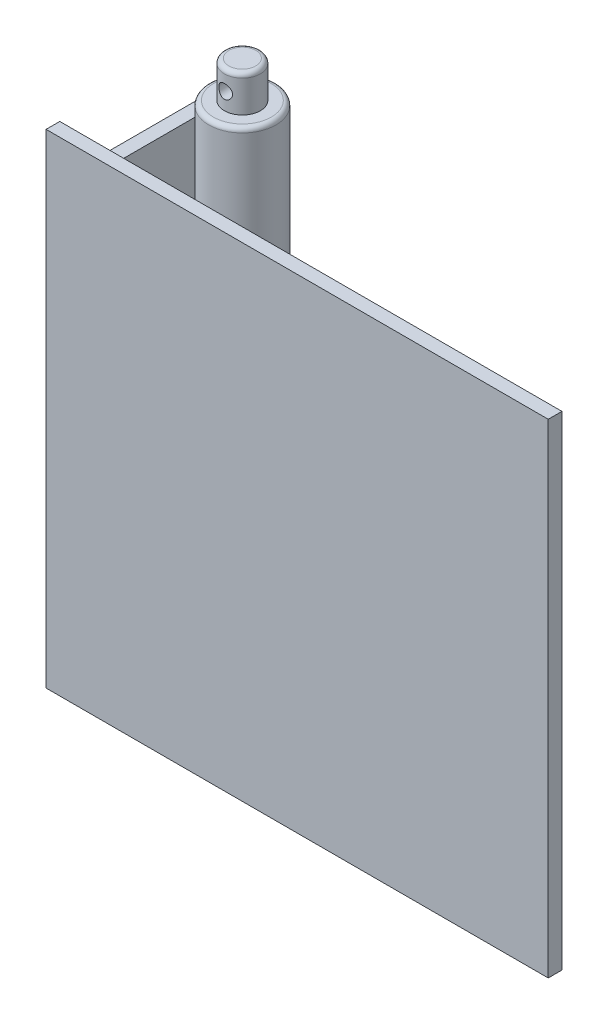
ISO-10303-21;
HEADER;
FILE_DESCRIPTION(('STEP AP214'),'2;1');
FILE_NAME('part.step','',(''),(''),'','','');
FILE_SCHEMA(('AUTOMOTIVE_DESIGN { 1 0 10303 214 1 1 1 1 }'));
ENDSEC;
DATA;
#1=APPLICATION_CONTEXT('core data for automotive mechanical design processes');
#2=APPLICATION_PROTOCOL_DEFINITION('international standard','automotive_design',2000,#1);
#3=PRODUCT_CONTEXT('',#1,'mechanical');
#4=PRODUCT('Part','Part','',(#3));
#5=PRODUCT_RELATED_PRODUCT_CATEGORY('part','',(#4));
#6=PRODUCT_DEFINITION_FORMATION('','',#4);
#7=PRODUCT_DEFINITION_CONTEXT('part definition',#1,'design');
#8=PRODUCT_DEFINITION('design','',#6,#7);
#9=PRODUCT_DEFINITION_SHAPE('','',#8);
#10=(LENGTH_UNIT() NAMED_UNIT(*) SI_UNIT(.MILLI.,.METRE.));
#11=(NAMED_UNIT(*) PLANE_ANGLE_UNIT() SI_UNIT($,.RADIAN.));
#12=(NAMED_UNIT(*) SI_UNIT($,.STERADIAN.) SOLID_ANGLE_UNIT());
#13=UNCERTAINTY_MEASURE_WITH_UNIT(LENGTH_MEASURE(1.E-05),#10,'distance_accuracy_value','');
#14=(GEOMETRIC_REPRESENTATION_CONTEXT(3) GLOBAL_UNCERTAINTY_ASSIGNED_CONTEXT((#13)) GLOBAL_UNIT_ASSIGNED_CONTEXT((#10,
#11,#12)) REPRESENTATION_CONTEXT('',''));
#15=CARTESIAN_POINT('',(0.,0.,0.));
#16=DIRECTION('',(0.,0.,1.));
#17=DIRECTION('',(1.,0.,0.));
#18=AXIS2_PLACEMENT_3D('',#15,#16,#17);
#19=CARTESIAN_POINT('',(4.99999999999997,90.,-38.));
#20=DIRECTION('',(1.,0.,0.));
#21=DIRECTION('',(0.,1.,0.));
#22=AXIS2_PLACEMENT_3D('',#19,#20,#21);
#23=PLANE('',#22);
#24=DIRECTION('',(0.,1.,0.));
#25=VECTOR('',#24,1.);
#26=CARTESIAN_POINT('',(4.99999999999996,90.,-26.));
#27=LINE('',#26,#25);
#28=CARTESIAN_POINT('',(4.99999999999996,-3.99999999999999,-26.));
#29=VERTEX_POINT('',#28);
#30=CARTESIAN_POINT('',(4.99999999999996,90.,-26.));
#31=VERTEX_POINT('',#30);
#32=EDGE_CURVE('E145',#29,#31,#27,.T.);
#33=ORIENTED_EDGE('',*,*,#32,.F.);
#34=DIRECTION('',(0.,0.,1.));
#35=VECTOR('',#34,1.);
#36=CARTESIAN_POINT('',(4.99999999999996,-3.99999999999999,-38.));
#37=LINE('',#36,#35);
#38=CARTESIAN_POINT('',(4.99999999999996,-3.99999999999999,0.));
#39=VERTEX_POINT('',#38);
#40=EDGE_CURVE('E180',#29,#39,#37,.T.);
#41=ORIENTED_EDGE('',*,*,#40,.T.);
#42=DIRECTION('',(0.,1.,0.));
#43=VECTOR('',#42,1.);
#44=CARTESIAN_POINT('',(4.99999999999997,90.,0.));
#45=LINE('',#44,#43);
#46=CARTESIAN_POINT('',(4.99999999999997,90.,0.));
#47=VERTEX_POINT('',#46);
#48=EDGE_CURVE('E168',#39,#47,#45,.T.);
#49=ORIENTED_EDGE('',*,*,#48,.T.);
#50=DIRECTION('',(0.,0.,1.));
#51=VECTOR('',#50,1.);
#52=CARTESIAN_POINT('',(4.99999999999997,90.,-38.));
#53=LINE('',#52,#51);
#54=EDGE_CURVE('E186',#31,#47,#53,.T.);
#55=ORIENTED_EDGE('',*,*,#54,.F.);
#56=EDGE_LOOP('',(#33,#41,#49,#55));
#57=FACE_BOUND('',#56,.T.);
#58=ADVANCED_FACE('F41',(#57),#23,.F.);
#59=CARTESIAN_POINT('',(7.99999999999997,90.,-38.));
#60=DIRECTION('',(0.,-1.,0.));
#61=DIRECTION('',(0.,0.,-1.));
#62=AXIS2_PLACEMENT_3D('',#59,#60,#61);
#63=PLANE('',#62);
#64=DIRECTION('',(1.,0.,0.));
#65=VECTOR('',#64,1.);
#66=CARTESIAN_POINT('',(7.99999999999997,90.,-26.));
#67=LINE('',#66,#65);
#68=CARTESIAN_POINT('',(7.71834496834681,90.,-26.));
#69=VERTEX_POINT('',#68);
#70=EDGE_CURVE('E138',#31,#69,#67,.T.);
#71=ORIENTED_EDGE('',*,*,#70,.F.);
#72=ORIENTED_EDGE('',*,*,#54,.T.);
#73=DIRECTION('',(1.,0.,0.));
#74=VECTOR('',#73,1.);
#75=CARTESIAN_POINT('',(7.99999999999997,90.,0.));
#76=LINE('',#75,#74);
#77=CARTESIAN_POINT('',(7.99999999999997,90.,0.));
#78=VERTEX_POINT('',#77);
#79=EDGE_CURVE('E171',#47,#78,#76,.T.);
#80=ORIENTED_EDGE('',*,*,#79,.T.);
#81=DIRECTION('',(0.,0.,1.));
#82=VECTOR('',#81,1.);
#83=CARTESIAN_POINT('',(7.99999999999997,90.,-38.));
#84=LINE('',#83,#82);
#85=CARTESIAN_POINT('',(7.99999999999997,90.,-22.7589065168986));
#86=VERTEX_POINT('',#85);
#87=EDGE_CURVE('E184',#86,#78,#84,.T.);
#88=ORIENTED_EDGE('',*,*,#87,.F.);
#89=CARTESIAN_POINT('',(15.,90.,-25.));
#90=DIRECTION('',(0.,-1.,0.));
#91=DIRECTION('',(0.,0.,-1.));
#92=AXIS2_PLACEMENT_3D('',#89,#90,#91);
#93=CIRCLE('',#92,7.35);
#94=EDGE_CURVE('E56',#69,#86,#93,.F.);
#95=ORIENTED_EDGE('',*,*,#94,.F.);
#96=EDGE_LOOP('',(#71,#72,#80,#88,#95));
#97=FACE_BOUND('',#96,.T.);
#98=ADVANCED_FACE('F266',(#97),#63,.F.);
#99=CARTESIAN_POINT('',(4.99999999999996,-3.99999999999999,-38.));
#100=DIRECTION('',(0.,1.,0.));
#101=DIRECTION('',(0.,0.,1.));
#102=AXIS2_PLACEMENT_3D('',#99,#100,#101);
#103=PLANE('',#102);
#104=DIRECTION('',(-1.,0.,0.));
#105=VECTOR('',#104,1.);
#106=CARTESIAN_POINT('',(7.99999999999996,-3.99999999999999,-26.));
#107=LINE('',#106,#105);
#108=CARTESIAN_POINT('',(7.71834496834681,-3.99999999999999,-26.));
#109=VERTEX_POINT('',#108);
#110=EDGE_CURVE('E146',#109,#29,#107,.T.);
#111=ORIENTED_EDGE('',*,*,#110,.F.);
#112=CARTESIAN_POINT('',(15.,-3.99999999999999,-25.));
#113=DIRECTION('',(0.,1.,0.));
#114=DIRECTION('',(0.,0.,1.));
#115=AXIS2_PLACEMENT_3D('',#112,#113,#114);
#116=CIRCLE('',#115,7.35);
#117=CARTESIAN_POINT('',(7.99999999999997,-3.99999999999999,-22.7589065168986));
#118=VERTEX_POINT('',#117);
#119=EDGE_CURVE('E64',#118,#109,#116,.F.);
#120=ORIENTED_EDGE('',*,*,#119,.F.);
#121=DIRECTION('',(0.,0.,1.));
#122=VECTOR('',#121,1.);
#123=CARTESIAN_POINT('',(7.99999999999997,-3.99999999999999,-38.));
#124=LINE('',#123,#122);
#125=CARTESIAN_POINT('',(7.99999999999997,-3.99999999999999,0.));
#126=VERTEX_POINT('',#125);
#127=EDGE_CURVE('E182',#118,#126,#124,.T.);
#128=ORIENTED_EDGE('',*,*,#127,.T.);
#129=DIRECTION('',(-1.,0.,0.));
#130=VECTOR('',#129,1.);
#131=CARTESIAN_POINT('',(4.99999999999996,-3.99999999999999,0.));
#132=LINE('',#131,#130);
#133=EDGE_CURVE('E177',#126,#39,#132,.T.);
#134=ORIENTED_EDGE('',*,*,#133,.T.);
#135=ORIENTED_EDGE('',*,*,#40,.F.);
#136=EDGE_LOOP('',(#111,#120,#128,#134,#135));
#137=FACE_BOUND('',#136,.T.);
#138=ADVANCED_FACE('F273',(#137),#103,.F.);
#139=CARTESIAN_POINT('',(7.99999999999997,-3.99999999999999,-38.));
#140=DIRECTION('',(-1.,0.,0.));
#141=DIRECTION('',(0.,0.,1.));
#142=AXIS2_PLACEMENT_3D('',#139,#140,#141);
#143=PLANE('',#142);
#144=DIRECTION('',(0.,-1.,0.));
#145=VECTOR('',#144,1.);
#146=CARTESIAN_POINT('',(7.99999999999997,95.,-22.7589065168986));
#147=LINE('',#146,#145);
#148=EDGE_CURVE('E162',#86,#118,#147,.T.);
#149=ORIENTED_EDGE('',*,*,#148,.F.);
#150=ORIENTED_EDGE('',*,*,#87,.T.);
#151=DIRECTION('',(0.,-1.,0.));
#152=VECTOR('',#151,1.);
#153=CARTESIAN_POINT('',(7.99999999999997,-3.99999999999999,0.));
#154=LINE('',#153,#152);
#155=EDGE_CURVE('E174',#78,#126,#154,.T.);
#156=ORIENTED_EDGE('',*,*,#155,.T.);
#157=ORIENTED_EDGE('',*,*,#127,.F.);
#158=EDGE_LOOP('',(#149,#150,#156,#157));
#159=FACE_BOUND('',#158,.T.);
#160=ADVANCED_FACE('F289',(#159),#143,.F.);
#161=CARTESIAN_POINT('',(0.,0.,0.));
#162=DIRECTION('',(0.,0.,-1.));
#163=DIRECTION('',(-1.,0.,0.));
#164=AXIS2_PLACEMENT_3D('',#161,#162,#163);
#165=PLANE('',#164);
#166=DIRECTION('',(0.,-1.,0.));
#167=VECTOR('',#166,1.);
#168=CARTESIAN_POINT('',(0.,-9.99999999999999,0.));
#169=LINE('',#168,#167);
#170=CARTESIAN_POINT('',(0.,96.,0.));
#171=VERTEX_POINT('',#170);
#172=CARTESIAN_POINT('',(0.,-9.99999999999999,0.));
#173=VERTEX_POINT('',#172);
#174=EDGE_CURVE('E188',#171,#173,#169,.T.);
#175=ORIENTED_EDGE('',*,*,#174,.F.);
#176=DIRECTION('',(-1.,0.,0.));
#177=VECTOR('',#176,1.);
#178=CARTESIAN_POINT('',(0.,96.,0.));
#179=LINE('',#178,#177);
#180=CARTESIAN_POINT('',(110.,96.,0.));
#181=VERTEX_POINT('',#180);
#182=EDGE_CURVE('E193',#181,#171,#179,.T.);
#183=ORIENTED_EDGE('',*,*,#182,.F.);
#184=DIRECTION('',(0.,1.,0.));
#185=VECTOR('',#184,1.);
#186=CARTESIAN_POINT('',(110.,-9.99999999999999,0.));
#187=LINE('',#186,#185);
#188=CARTESIAN_POINT('',(110.,-9.99999999999999,0.));
#189=VERTEX_POINT('',#188);
#190=EDGE_CURVE('E204',#189,#181,#187,.T.);
#191=ORIENTED_EDGE('',*,*,#190,.F.);
#192=DIRECTION('',(1.,0.,0.));
#193=VECTOR('',#192,1.);
#194=CARTESIAN_POINT('',(0.,-9.99999999999999,0.));
#195=LINE('',#194,#193);
#196=EDGE_CURVE('E202',#173,#189,#195,.T.);
#197=ORIENTED_EDGE('',*,*,#196,.F.);
#198=EDGE_LOOP('',(#175,#183,#191,#197));
#199=FACE_BOUND('',#198,.T.);
#200=ORIENTED_EDGE('',*,*,#79,.F.);
#201=ORIENTED_EDGE('',*,*,#48,.F.);
#202=ORIENTED_EDGE('',*,*,#133,.F.);
#203=ORIENTED_EDGE('',*,*,#155,.F.);
#204=EDGE_LOOP('',(#200,#201,#202,#203));
#205=FACE_BOUND('',#204,.T.);
#206=ADVANCED_FACE('F285',(#199,#205),#165,.T.);
#207=CARTESIAN_POINT('',(0.,-9.99999999999999,3.));
#208=DIRECTION('',(1.,0.,0.));
#209=DIRECTION('',(0.,1.,0.));
#210=AXIS2_PLACEMENT_3D('',#207,#208,#209);
#211=PLANE('',#210);
#212=ORIENTED_EDGE('',*,*,#174,.T.);
#213=DIRECTION('',(0.,0.,-1.));
#214=VECTOR('',#213,1.);
#215=CARTESIAN_POINT('',(0.,-9.99999999999999,3.));
#216=LINE('',#215,#214);
#217=CARTESIAN_POINT('',(0.,-9.99999999999999,3.));
#218=VERTEX_POINT('',#217);
#219=EDGE_CURVE('E215',#218,#173,#216,.T.);
#220=ORIENTED_EDGE('',*,*,#219,.F.);
#221=DIRECTION('',(0.,-1.,0.));
#222=VECTOR('',#221,1.);
#223=CARTESIAN_POINT('',(0.,-9.99999999999999,3.));
#224=LINE('',#223,#222);
#225=CARTESIAN_POINT('',(0.,96.,3.));
#226=VERTEX_POINT('',#225);
#227=EDGE_CURVE('E189',#226,#218,#224,.T.);
#228=ORIENTED_EDGE('',*,*,#227,.F.);
#229=DIRECTION('',(0.,0.,-1.));
#230=VECTOR('',#229,1.);
#231=CARTESIAN_POINT('',(0.,96.,3.));
#232=LINE('',#231,#230);
#233=EDGE_CURVE('E199',#226,#171,#232,.T.);
#234=ORIENTED_EDGE('',*,*,#233,.T.);
#235=EDGE_LOOP('',(#212,#220,#228,#234));
#236=FACE_BOUND('',#235,.T.);
#237=ADVANCED_FACE('F288',(#236),#211,.F.);
#238=CARTESIAN_POINT('',(0.,-9.99999999999999,3.));
#239=DIRECTION('',(0.,1.,0.));
#240=DIRECTION('',(0.,0.,1.));
#241=AXIS2_PLACEMENT_3D('',#238,#239,#240);
#242=PLANE('',#241);
#243=ORIENTED_EDGE('',*,*,#196,.T.);
#244=DIRECTION('',(0.,0.,-1.));
#245=VECTOR('',#244,1.);
#246=CARTESIAN_POINT('',(110.,-9.99999999999999,3.));
#247=LINE('',#246,#245);
#248=CARTESIAN_POINT('',(110.,-9.99999999999999,3.));
#249=VERTEX_POINT('',#248);
#250=EDGE_CURVE('E212',#249,#189,#247,.T.);
#251=ORIENTED_EDGE('',*,*,#250,.F.);
#252=DIRECTION('',(1.,0.,0.));
#253=VECTOR('',#252,1.);
#254=CARTESIAN_POINT('',(0.,-9.99999999999999,3.));
#255=LINE('',#254,#253);
#256=EDGE_CURVE('E192',#218,#249,#255,.T.);
#257=ORIENTED_EDGE('',*,*,#256,.F.);
#258=ORIENTED_EDGE('',*,*,#219,.T.);
#259=EDGE_LOOP('',(#243,#251,#257,#258));
#260=FACE_BOUND('',#259,.T.);
#261=ADVANCED_FACE('F297',(#260),#242,.F.);
#262=CARTESIAN_POINT('',(110.,-9.99999999999999,3.));
#263=DIRECTION('',(-1.,0.,0.));
#264=DIRECTION('',(0.,-1.,0.));
#265=AXIS2_PLACEMENT_3D('',#262,#263,#264);
#266=PLANE('',#265);
#267=ORIENTED_EDGE('',*,*,#190,.T.);
#268=DIRECTION('',(0.,0.,-1.));
#269=VECTOR('',#268,1.);
#270=CARTESIAN_POINT('',(110.,96.,3.));
#271=LINE('',#270,#269);
#272=CARTESIAN_POINT('',(110.,96.,3.));
#273=VERTEX_POINT('',#272);
#274=EDGE_CURVE('E209',#273,#181,#271,.T.);
#275=ORIENTED_EDGE('',*,*,#274,.F.);
#276=DIRECTION('',(0.,1.,0.));
#277=VECTOR('',#276,1.);
#278=CARTESIAN_POINT('',(110.,-9.99999999999999,3.));
#279=LINE('',#278,#277);
#280=EDGE_CURVE('E195',#249,#273,#279,.T.);
#281=ORIENTED_EDGE('',*,*,#280,.F.);
#282=ORIENTED_EDGE('',*,*,#250,.T.);
#283=EDGE_LOOP('',(#267,#275,#281,#282));
#284=FACE_BOUND('',#283,.T.);
#285=ADVANCED_FACE('F293',(#284),#266,.F.);
#286=CARTESIAN_POINT('',(0.,96.,3.));
#287=DIRECTION('',(0.,-1.,0.));
#288=DIRECTION('',(0.,0.,-1.));
#289=AXIS2_PLACEMENT_3D('',#286,#287,#288);
#290=PLANE('',#289);
#291=ORIENTED_EDGE('',*,*,#182,.T.);
#292=ORIENTED_EDGE('',*,*,#233,.F.);
#293=DIRECTION('',(-1.,0.,0.));
#294=VECTOR('',#293,1.);
#295=CARTESIAN_POINT('',(0.,96.,3.));
#296=LINE('',#295,#294);
#297=EDGE_CURVE('E197',#273,#226,#296,.T.);
#298=ORIENTED_EDGE('',*,*,#297,.F.);
#299=ORIENTED_EDGE('',*,*,#274,.T.);
#300=EDGE_LOOP('',(#291,#292,#298,#299));
#301=FACE_BOUND('',#300,.T.);
#302=ADVANCED_FACE('F283',(#301),#290,.F.);
#303=CARTESIAN_POINT('',(0.,0.,3.));
#304=DIRECTION('',(0.,0.,-1.));
#305=DIRECTION('',(-1.,0.,0.));
#306=AXIS2_PLACEMENT_3D('',#303,#304,#305);
#307=PLANE('',#306);
#308=ORIENTED_EDGE('',*,*,#227,.T.);
#309=ORIENTED_EDGE('',*,*,#256,.T.);
#310=ORIENTED_EDGE('',*,*,#280,.T.);
#311=ORIENTED_EDGE('',*,*,#297,.T.);
#312=EDGE_LOOP('',(#308,#309,#310,#311));
#313=FACE_BOUND('',#312,.T.);
#314=ADVANCED_FACE('F279',(#313),#307,.F.);
#315=CARTESIAN_POINT('',(15.,95.,-25.));
#316=DIRECTION('',(0.,-1.,0.));
#317=DIRECTION('',(0.,0.,-1.));
#318=AXIS2_PLACEMENT_3D('',#315,#316,#317);
#319=CYLINDRICAL_SURFACE('',#318,7.35);
#320=CARTESIAN_POINT('',(15.,-13.6220112645898,-25.));
#321=DIRECTION('',(0.,1.,0.));
#322=DIRECTION('',(0.,0.,1.));
#323=AXIS2_PLACEMENT_3D('',#320,#321,#322);
#324=CIRCLE('',#323,7.35);
#325=CARTESIAN_POINT('',(15.,-13.6220112645898,-17.65));
#326=VERTEX_POINT('',#325);
#327=EDGE_CURVE('E11',#326,#326,#324,.T.);
#328=ORIENTED_EDGE('',*,*,#327,.T.);
#329=EDGE_LOOP('',(#328));
#330=FACE_BOUND('',#329,.T.);
#331=CARTESIAN_POINT('',(15.,94.,-25.));
#332=DIRECTION('',(0.,1.,0.));
#333=DIRECTION('',(0.,0.,1.));
#334=AXIS2_PLACEMENT_3D('',#331,#332,#333);
#335=CIRCLE('',#334,7.35);
#336=CARTESIAN_POINT('',(15.,94.,-17.65));
#337=VERTEX_POINT('',#336);
#338=EDGE_CURVE('E227',#337,#337,#335,.F.);
#339=ORIENTED_EDGE('',*,*,#338,.T.);
#340=EDGE_LOOP('',(#339));
#341=FACE_BOUND('',#340,.T.);
#342=DIRECTION('',(0.,-1.,0.));
#343=VECTOR('',#342,1.);
#344=CARTESIAN_POINT('',(7.99999999999997,95.,-27.2410934831015));
#345=LINE('',#344,#343);
#346=CARTESIAN_POINT('',(7.99999999999997,-3.99999999999999,-27.2410934831015));
#347=VERTEX_POINT('',#346);
#348=CARTESIAN_POINT('',(7.99999999999997,90.,-27.2410934831015));
#349=VERTEX_POINT('',#348);
#350=EDGE_CURVE('E134',#347,#349,#345,.F.);
#351=ORIENTED_EDGE('',*,*,#350,.T.);
#352=EDGE_CURVE('E166',#349,#69,#93,.F.);
#353=ORIENTED_EDGE('',*,*,#352,.T.);
#354=ORIENTED_EDGE('',*,*,#94,.T.);
#355=ORIENTED_EDGE('',*,*,#148,.T.);
#356=ORIENTED_EDGE('',*,*,#119,.T.);
#357=EDGE_CURVE('E143',#109,#347,#116,.F.);
#358=ORIENTED_EDGE('',*,*,#357,.T.);
#359=EDGE_LOOP('',(#351,#353,#354,#355,#356,#358));
#360=FACE_BOUND('',#359,.T.);
#361=ADVANCED_FACE('F282',(#330,#341,#360),#319,.T.);
#362=CARTESIAN_POINT('',(15.,95.,-25.));
#363=DIRECTION('',(0.,1.,0.));
#364=DIRECTION('',(0.,0.,1.));
#365=AXIS2_PLACEMENT_3D('',#362,#363,#364);
#366=PLANE('',#365);
#367=CARTESIAN_POINT('',(15.,95.,-25.));
#368=DIRECTION('',(0.,1.,0.));
#369=DIRECTION('',(0.,0.,1.));
#370=AXIS2_PLACEMENT_3D('',#367,#368,#369);
#371=CIRCLE('',#370,6.35);
#372=CARTESIAN_POINT('',(15.,95.,-18.65));
#373=VERTEX_POINT('',#372);
#374=EDGE_CURVE('E224',#373,#373,#371,.T.);
#375=ORIENTED_EDGE('',*,*,#374,.T.);
#376=EDGE_LOOP('',(#375));
#377=FACE_BOUND('',#376,.T.);
#378=CARTESIAN_POINT('',(14.9999999999998,95.,-24.9999999999995));
#379=DIRECTION('',(0.,1.,0.));
#380=DIRECTION('',(0.,0.,1.));
#381=AXIS2_PLACEMENT_3D('',#378,#379,#380);
#382=CIRCLE('',#381,3.95);
#383=CARTESIAN_POINT('',(14.9999999999998,95.,-21.0499999999995));
#384=VERTEX_POINT('',#383);
#385=EDGE_CURVE('E158',#384,#384,#382,.T.);
#386=ORIENTED_EDGE('',*,*,#385,.F.);
#387=EDGE_LOOP('',(#386));
#388=FACE_BOUND('',#387,.T.);
#389=ADVANCED_FACE('F312',(#377,#388),#366,.T.);
#390=CARTESIAN_POINT('',(0.608524712566505,-14.1220112645898,0.355185644143535));
#391=DIRECTION('',(0.,1.,0.));
#392=DIRECTION('',(0.999707965195471,0.,-0.0241657676214048));
#393=AXIS2_PLACEMENT_3D('',#390,#391,#392);
#394=PLANE('',#393);
#395=CARTESIAN_POINT('',(15.,-14.1220112645898,-25.));
#396=DIRECTION('',(0.,1.,0.));
#397=DIRECTION('',(0.,0.,1.));
#398=AXIS2_PLACEMENT_3D('',#395,#396,#397);
#399=CIRCLE('',#398,6.85);
#400=CARTESIAN_POINT('',(15.,-14.1220112645898,-18.15));
#401=VERTEX_POINT('',#400);
#402=EDGE_CURVE('E49',#401,#401,#399,.F.);
#403=ORIENTED_EDGE('',*,*,#402,.T.);
#404=EDGE_LOOP('',(#403));
#405=FACE_BOUND('',#404,.T.);
#406=ADVANCED_FACE('F263',(#405),#394,.F.);
#407=CARTESIAN_POINT('',(14.9999999999998,103.,-24.9999999999995));
#408=DIRECTION('',(0.,-1.,0.));
#409=DIRECTION('',(0.,0.,-1.));
#410=AXIS2_PLACEMENT_3D('',#407,#408,#409);
#411=CYLINDRICAL_SURFACE('',#410,3.95);
#412=CARTESIAN_POINT('',(14.9999999999998,100.17798873541,-28.9499999999995));
#413=CARTESIAN_POINT('',(14.9188382184186,100.177991995215,-28.9500024642297));
#414=CARTESIAN_POINT('',(14.8376984647472,100.171381035976,-28.9474769205789));
#415=CARTESIAN_POINT('',(14.6778478434432,100.14522214936,-28.9376549503403));
#416=CARTESIAN_POINT('',(14.5991365608245,100.125676445279,-28.9303593436601));
#417=CARTESIAN_POINT('',(14.4464716206295,100.074441715519,-28.9117791558993));
#418=CARTESIAN_POINT('',(14.3725089721815,100.042776478792,-28.9005023926174));
#419=CARTESIAN_POINT('',(14.2309520789474,99.9683241467149,-28.8750798343882));
#420=CARTESIAN_POINT('',(14.163359594189,99.925533989837,-28.8609332499148));
#421=CARTESIAN_POINT('',(14.0335288433706,99.8281086813638,-28.8305422582574));
#422=CARTESIAN_POINT('',(13.9716033698914,99.7730757233858,-28.8142374437165));
#423=CARTESIAN_POINT('',(13.8576071765479,99.6535714821281,-28.7816609990706));
#424=CARTESIAN_POINT('',(13.8055395857645,99.5890972134737,-28.7653893811187));
#425=CARTESIAN_POINT('',(13.7107226341185,99.4494547531172,-28.7340139807829));
#426=CARTESIAN_POINT('',(13.6684194677018,99.3739660505329,-28.7189811472666));
#427=CARTESIAN_POINT('',(13.5972491009094,99.2162851458402,-28.6927279418792));
#428=CARTESIAN_POINT('',(13.5683763781683,99.1340957153218,-28.6815060035473));
#429=CARTESIAN_POINT('',(13.5261285368883,98.9689504995138,-28.6647923008312));
#430=CARTESIAN_POINT('',(13.5121553858124,98.8861707498665,-28.6590803734497));
#431=CARTESIAN_POINT('',(13.4982337154417,98.7192594814042,-28.6533902534417));
#432=CARTESIAN_POINT('',(13.4982792129917,98.635128554602,-28.6534096147027));
#433=CARTESIAN_POINT('',(13.5119370428937,98.4734242607008,-28.6589904370708));
#434=CARTESIAN_POINT('',(13.5247131869138,98.3957662715966,-28.6642103093522));
#435=CARTESIAN_POINT('',(13.5620850745512,98.2437925846353,-28.6790352704854));
#436=CARTESIAN_POINT('',(13.5866826448148,98.1694774052505,-28.6886410370339));
#437=CARTESIAN_POINT('',(13.6474482503224,98.0246177866717,-28.7113568161828));
#438=CARTESIAN_POINT('',(13.6838295486548,97.9541732521125,-28.7245306217029));
#439=CARTESIAN_POINT('',(13.7669810449546,97.8201489548894,-28.7528775768475));
#440=CARTESIAN_POINT('',(13.8137548933846,97.7565716160712,-28.7680514282397));
#441=CARTESIAN_POINT('',(13.9201659808153,97.6334672439081,-28.7999666944869));
#442=CARTESIAN_POINT('',(13.9804684837181,97.5745231347972,-28.8167439972124));
#443=CARTESIAN_POINT('',(14.1102929994662,97.4674084665306,-28.8490767862669));
#444=CARTESIAN_POINT('',(14.1798164994815,97.4192396485966,-28.8646320748626));
#445=CARTESIAN_POINT('',(14.3276271334903,97.3343778867576,-28.893091604615));
#446=CARTESIAN_POINT('',(14.4060381125745,97.2978837337005,-28.9059487583243));
#447=CARTESIAN_POINT('',(14.5684967665976,97.238799269797,-28.9272128831301));
#448=CARTESIAN_POINT('',(14.6525418521138,97.2162026196195,-28.935621883002));
#449=CARTESIAN_POINT('',(14.8189806418308,97.1866860290469,-28.9466831653289));
#450=CARTESIAN_POINT('',(14.9012161815626,97.1789814191137,-28.9496232620737));
#451=CARTESIAN_POINT('',(15.0658484188421,97.1771768469682,-28.9503080833161));
#452=CARTESIAN_POINT('',(15.1482450752724,97.1830737765589,-28.9480539947788));
#453=CARTESIAN_POINT('',(15.3074391393202,97.2077119465277,-28.9387933799194));
#454=CARTESIAN_POINT('',(15.3843290559311,97.2259351596397,-28.931978638703));
#455=CARTESIAN_POINT('',(15.5339028125363,97.2740223118751,-28.9144759898249));
#456=CARTESIAN_POINT('',(15.6065861046733,97.3038877633462,-28.9037875789793));
#457=CARTESIAN_POINT('',(15.7481004569603,97.3753697415241,-28.8791957153859));
#458=CARTESIAN_POINT('',(15.8167533756158,97.4173084631528,-28.8652063250684));
#459=CARTESIAN_POINT('',(15.9462797229843,97.5113836315997,-28.8355543061161));
#460=CARTESIAN_POINT('',(16.0071502148119,97.5635239095482,-28.8198910498775));
#461=CARTESIAN_POINT('',(16.1231754210418,97.6801716000269,-28.7874557356838));
#462=CARTESIAN_POINT('',(16.1777743273675,97.7452303732541,-28.7706731688414));
#463=CARTESIAN_POINT('',(16.2753944917805,97.8839110472407,-28.7387850504236));
#464=CARTESIAN_POINT('',(16.3184145644737,97.9575338236441,-28.7236796706447));
#465=CARTESIAN_POINT('',(16.3917379473137,98.1119470451761,-28.6969047731033));
#466=CARTESIAN_POINT('',(16.4219754645379,98.1927720419321,-28.6852531215953));
#467=CARTESIAN_POINT('',(16.4682059146255,98.3589345735795,-28.6670833492012));
#468=CARTESIAN_POINT('',(16.4842079683956,98.4442691818953,-28.6605619415899));
#469=CARTESIAN_POINT('',(16.5006872960534,98.6109888250315,-28.6538348847936));
#470=CARTESIAN_POINT('',(16.5021154693034,98.6922650040783,-28.6532424422992));
#471=CARTESIAN_POINT('',(16.4918540266949,98.8538352097054,-28.6574447112528));
#472=CARTESIAN_POINT('',(16.4801657218202,98.9341293336306,-28.662238884312));
#473=CARTESIAN_POINT('',(16.4447505304818,99.0888348409384,-28.6763485735749));
#474=CARTESIAN_POINT('',(16.4214221547168,99.1633523260449,-28.6855140039445));
#475=CARTESIAN_POINT('',(16.3637439954591,99.3074567544146,-28.707242553388));
#476=CARTESIAN_POINT('',(16.3293913928708,99.3770424309619,-28.7198065414056));
#477=CARTESIAN_POINT('',(16.2485138647777,99.5133474631837,-28.747750544578));
#478=CARTESIAN_POINT('',(16.2014371406444,99.5797156260938,-28.7632450661525));
#479=CARTESIAN_POINT('',(16.0972928577378,99.7039133685259,-28.7949187580043));
#480=CARTESIAN_POINT('',(16.0402220828133,99.7617401883107,-28.8110981474018));
#481=CARTESIAN_POINT('',(15.9138876153773,99.8705227332791,-28.8434081697665));
#482=CARTESIAN_POINT('',(15.8441197429192,99.9209115250619,-28.8594852212448));
#483=CARTESIAN_POINT('',(15.6965400388454,100.009239101708,-28.8888286234488));
#484=CARTESIAN_POINT('',(15.6187272305823,100.04717637263,-28.9020946323191));
#485=CARTESIAN_POINT('',(15.4527760423605,100.110925613725,-28.9249034205145));
#486=CARTESIAN_POINT('',(15.364306841726,100.135970990485,-28.9342060796982));
#487=CARTESIAN_POINT('',(15.1838810781279,100.169496269406,-28.9467513511912));
#488=CARTESIAN_POINT('',(15.0919264097606,100.177985043252,-28.9499972089341));
#489=CARTESIAN_POINT('',(14.9999999999998,100.17798873541,-28.9499999999995));
#490=B_SPLINE_CURVE_WITH_KNOTS('',3,(#412,#413,#414,#415,#416,#417,#418,#419,#420,#421,#422,
#423,#424,#425,#426,#427,#428,#429,#430,#431,#432,#433,#434,#435,#436,#437,#438,#439,#440,#441,
#442,#443,#444,#445,#446,#447,#448,#449,#450,#451,#452,#453,#454,#455,#456,#457,#458,#459,#460,
#461,#462,#463,#464,#465,#466,#467,#468,#469,#470,#471,#472,#473,#474,#475,#476,#477,#478,#479,
#480,#481,#482,#483,#484,#485,#486,#487,#488,#489),.UNSPECIFIED.,.T.,.F.,(4,2,2,2,2,2,2,2,2,2,2,
2,2,2,2,2,2,2,2,2,2,2,2,2,2,2,2,2,2,2,2,2,2,2,2,2,2,2,4),(0.,0.243146193662997,
0.486250604858374,0.728880263111803,0.97157676275917,1.22376512608258,1.47603340511198,
1.73820774038464,2.0002741786208,2.25137261277041,2.50236387832667,2.73788855879894,
2.97344964424191,3.21353744444614,3.45370971102292,3.71046812044703,3.96726799055135,
4.22823275106619,4.48907838432734,4.73575910951624,4.98238346929789,5.21923881371646,
5.45612493632834,5.7000354666674,5.94403777249992,6.2025624056296,6.46111349540771,
6.7209796281366,6.98067913998999,7.22331650944356,7.46592962960196,7.70075432825631,
7.93563912377423,8.18306000325451,8.430560651212,8.69193629902898,8.95334371493506,
9.22888649827887,9.50428159428321),.UNSPECIFIED.);
#491=CARTESIAN_POINT('',(14.9999999999998,100.17798873541,-28.9499999999995));
#492=VERTEX_POINT('',#491);
#493=EDGE_CURVE('E164',#492,#492,#490,.T.);
#494=ORIENTED_EDGE('',*,*,#493,.T.);
#495=EDGE_LOOP('',(#494));
#496=FACE_BOUND('',#495,.T.);
#497=CARTESIAN_POINT('',(13.4999999999998,98.6779887354103,-21.3458927218808));
#498=CARTESIAN_POINT('',(13.4999965759153,98.7589113283758,-21.3458959629377));
#499=CARTESIAN_POINT('',(13.5065701713922,98.8398117063886,-21.3431754558425));
#500=CARTESIAN_POINT('',(13.5325670422106,98.9991684149255,-21.3326664638089));
#501=CARTESIAN_POINT('',(13.5519896805547,99.0776248664066,-21.3248782301057));
#502=CARTESIAN_POINT('',(13.6028652385147,99.2297460466708,-21.3052405283201));
#503=CARTESIAN_POINT('',(13.6342886716328,99.3034220063319,-21.2934010217571));
#504=CARTESIAN_POINT('',(13.708168999113,99.4444853372865,-21.2670110348734));
#505=CARTESIAN_POINT('',(13.750629295688,99.5118707607445,-21.2524597190051));
#506=CARTESIAN_POINT('',(13.8476970956712,99.6418768188655,-21.2214544008403));
#507=CARTESIAN_POINT('',(13.9027766403957,99.7041315224336,-21.2049434539938));
#508=CARTESIAN_POINT('',(14.0225185854721,99.8187792886051,-21.1723536068296));
#509=CARTESIAN_POINT('',(14.0871830919008,99.8711701781022,-21.1562748023849));
#510=CARTESIAN_POINT('',(14.2270494222887,99.9663786049166,-21.1256818270001));
#511=CARTESIAN_POINT('',(14.302540961666,100.008796624323,-21.1112421699814));
#512=CARTESIAN_POINT('',(14.4602340318537,100.08017815503,-21.0862406532149));
#513=CARTESIAN_POINT('',(14.5424331592401,100.10914646088,-21.0756774118853));
#514=CARTESIAN_POINT('',(14.7073597220147,100.151517575168,-21.0600232992239));
#515=CARTESIAN_POINT('',(14.7899038307755,100.165550762714,-21.0547115426676));
#516=CARTESIAN_POINT('',(14.9563349473083,100.179674982479,-21.0493651263897));
#517=CARTESIAN_POINT('',(15.0402214979475,100.179770663795,-21.0493287069883));
#518=CARTESIAN_POINT('',(15.2024308701676,100.166380252889,-21.0543977010841));
#519=CARTESIAN_POINT('',(15.2808201031131,100.153582695805,-21.0592424471681));
#520=CARTESIAN_POINT('',(15.4342422774608,100.115929705674,-21.0731857677786));
#521=CARTESIAN_POINT('',(15.5092749801327,100.091073416445,-21.0822846443509));
#522=CARTESIAN_POINT('',(15.6551628378542,100.029698073003,-21.1040039535902));
#523=CARTESIAN_POINT('',(15.725940551455,99.9930132596901,-21.1166740939786));
#524=CARTESIAN_POINT('',(15.8605126790246,99.9091704381612,-21.1442583812807));
#525=CARTESIAN_POINT('',(15.9243047996482,99.8620090058063,-21.1591732613414));
#526=CARTESIAN_POINT('',(16.0471442815878,99.7552536661391,-21.1907677606557));
#527=CARTESIAN_POINT('',(16.1056791129639,99.6950845803995,-21.2074995740286));
#528=CARTESIAN_POINT('',(16.2120239513817,99.5656901254435,-21.2401330812157));
#529=CARTESIAN_POINT('',(16.2598311218312,99.4964623685895,-21.2560345546219));
#530=CARTESIAN_POINT('',(16.3443776972942,99.3488438303983,-21.2855408249418));
#531=CARTESIAN_POINT('',(16.3808337148938,99.2702773327077,-21.2990835783344));
#532=CARTESIAN_POINT('',(16.4398020485375,99.1074701226567,-21.3216201202495));
#533=CARTESIAN_POINT('',(16.4623223619244,99.0232326955322,-21.3306165172646));
#534=CARTESIAN_POINT('',(16.4915991852719,98.8565495386281,-21.3424231231718));
#535=CARTESIAN_POINT('',(16.4991719734213,98.7742700349975,-21.345553160639));
#536=CARTESIAN_POINT('',(16.5006985960008,98.6095744203005,-21.3461791536848));
#537=CARTESIAN_POINT('',(16.494655960231,98.5271583501743,-21.3436765695213));
#538=CARTESIAN_POINT('',(16.4698639946504,98.3687787583446,-21.3336447656882));
#539=CARTESIAN_POINT('',(16.4517540849999,98.2926972240855,-21.3263687651952));
#540=CARTESIAN_POINT('',(16.4041507743241,98.1446903296405,-21.3079128421524));
#541=CARTESIAN_POINT('',(16.3746550051824,98.0727658376476,-21.2967321075129));
#542=CARTESIAN_POINT('',(16.3038546722809,97.9320659392547,-21.2712030754661));
#543=CARTESIAN_POINT('',(16.2621430523084,97.8635148809622,-21.2567503342785));
#544=CARTESIAN_POINT('',(16.168524912942,97.7340959483273,-21.2264782018434));
#545=CARTESIAN_POINT('',(16.1166145808621,97.6732309613674,-21.2106583007396));
#546=CARTESIAN_POINT('',(16.000062933392,97.5567871792516,-21.1781860670617));
#547=CARTESIAN_POINT('',(15.9348116088813,97.5018131645558,-21.161546839634));
#548=CARTESIAN_POINT('',(15.7956034838874,97.4035187572834,-21.1302975050462));
#549=CARTESIAN_POINT('',(15.7216466007736,97.3601984753335,-21.1156874171491));
#550=CARTESIAN_POINT('',(15.5671218990224,97.2867061210714,-21.0901432332362));
#551=CARTESIAN_POINT('',(15.4865741096929,97.2564958518279,-21.0791984795781));
#552=CARTESIAN_POINT('',(15.3210279513729,97.2102293075707,-21.0621897520036));
#553=CARTESIAN_POINT('',(15.2360317551159,97.1941661897735,-21.0561234185858));
#554=CARTESIAN_POINT('',(15.0694609071304,97.1774017470656,-21.049783872614));
#555=CARTESIAN_POINT('',(14.9879842240574,97.1758419729351,-21.049186959332));
#556=CARTESIAN_POINT('',(14.8259778570679,97.1859094053434,-21.0530038575145));
#557=CARTESIAN_POINT('',(14.7454480552554,97.1975349522325,-21.0574170383533));
#558=CARTESIAN_POINT('',(14.5897128945613,97.2330377467945,-21.0706078170547));
#559=CARTESIAN_POINT('',(14.5144240979689,97.256594710976,-21.0792711434153));
#560=CARTESIAN_POINT('',(14.3688650308219,97.3149695664681,-21.1000538964038));
#561=CARTESIAN_POINT('',(14.2985957138782,97.3497895906477,-21.1121739775808));
#562=CARTESIAN_POINT('',(14.1617965616858,97.4313832076971,-21.1393025025135));
#563=CARTESIAN_POINT('',(14.0955526519747,97.4786020017281,-21.1544118238639));
#564=CARTESIAN_POINT('',(13.9716659564849,97.5829570033448,-21.1856693712228));
#565=CARTESIAN_POINT('',(13.9140262850683,97.6400967857898,-21.2018179703928));
#566=CARTESIAN_POINT('',(13.8057499108151,97.7663683164685,-21.2344138687577));
#567=CARTESIAN_POINT('',(13.7556653999317,97.8359836147565,-21.2508295558532));
#568=CARTESIAN_POINT('',(13.6678758287808,97.983159382232,-21.2811144584219));
#569=CARTESIAN_POINT('',(13.6301726694992,98.0607210690818,-21.2949832827154));
#570=CARTESIAN_POINT('',(13.5667676189238,98.2262018362757,-21.3190258576476));
#571=CARTESIAN_POINT('',(13.5418367003764,98.3144555900435,-21.3289554440259));
#572=CARTESIAN_POINT('',(13.5084606734012,98.4944803511736,-21.3423847606846));
#573=CARTESIAN_POINT('',(13.5000038817987,98.5862488188305,-21.3458890475758));
#574=CARTESIAN_POINT('',(13.4999999999998,98.6779887354103,-21.3458927218808));
#575=B_SPLINE_CURVE_WITH_KNOTS('',3,(#497,#498,#499,#500,#501,#502,#503,#504,#505,#506,#507,
#508,#509,#510,#511,#512,#513,#514,#515,#516,#517,#518,#519,#520,#521,#522,#523,#524,#525,#526,
#527,#528,#529,#530,#531,#532,#533,#534,#535,#536,#537,#538,#539,#540,#541,#542,#543,#544,#545,
#546,#547,#548,#549,#550,#551,#552,#553,#554,#555,#556,#557,#558,#559,#560,#561,#562,#563,#564,
#565,#566,#567,#568,#569,#570,#571,#572,#573,#574),.UNSPECIFIED.,.T.,.F.,(4,2,2,2,2,2,2,2,2,2,2,
2,2,2,2,2,2,2,2,2,2,2,2,2,2,2,2,2,2,2,2,2,2,2,2,2,2,2,4),(0.,0.242425943440425,
0.484839869399901,0.72666196596649,0.968558694966047,1.22167431118402,1.47484562645702,
1.73688313328173,1.99882715718829,2.24921384178735,2.4995170053892,2.73712638365117,
2.97475263488412,3.21586520293897,3.45705669156448,3.71268448983916,3.96837980139327,
4.23002424392532,4.49151839584408,4.73828729432003,4.984992225297,5.21956625190945,
5.45418909329515,5.6977500218305,5.9414021770251,6.2009658921801,6.4605320712388,
6.71933682403015,6.97801632765158,7.22127958841126,7.4645122327755,7.70153665764071,
7.9386059937733,8.18575257338472,8.43298839358296,8.69368601936149,8.95442365297424,
9.22945098830345,9.50428320774921),.UNSPECIFIED.);
#576=CARTESIAN_POINT('',(13.4999999999998,98.6779887354103,-21.3458927218808));
#577=VERTEX_POINT('',#576);
#578=EDGE_CURVE('E156',#577,#577,#575,.T.);
#579=ORIENTED_EDGE('',*,*,#578,.T.);
#580=EDGE_LOOP('',(#579));
#581=FACE_BOUND('',#580,.T.);
#582=CARTESIAN_POINT('',(14.9999999999998,102.,-24.9999999999995));
#583=DIRECTION('',(0.,1.,0.));
#584=DIRECTION('',(0.,0.,1.));
#585=AXIS2_PLACEMENT_3D('',#582,#583,#584);
#586=CIRCLE('',#585,3.95);
#587=CARTESIAN_POINT('',(14.9999999999998,102.,-21.0499999999995));
#588=VERTEX_POINT('',#587);
#589=EDGE_CURVE('E221',#588,#588,#586,.F.);
#590=ORIENTED_EDGE('',*,*,#589,.T.);
#591=EDGE_LOOP('',(#590));
#592=FACE_BOUND('',#591,.T.);
#593=ORIENTED_EDGE('',*,*,#385,.T.);
#594=EDGE_LOOP('',(#593));
#595=FACE_BOUND('',#594,.T.);
#596=ADVANCED_FACE('F240',(#496,#581,#592,#595),#411,.T.);
#597=CARTESIAN_POINT('',(14.9999999999998,103.,-24.9999999999995));
#598=DIRECTION('',(0.,1.,0.));
#599=DIRECTION('',(0.,0.,1.));
#600=AXIS2_PLACEMENT_3D('',#597,#598,#599);
#601=PLANE('',#600);
#602=CARTESIAN_POINT('',(14.9999999999998,103.,-24.9999999999995));
#603=DIRECTION('',(0.,1.,0.));
#604=DIRECTION('',(0.,0.,1.));
#605=AXIS2_PLACEMENT_3D('',#602,#603,#604);
#606=CIRCLE('',#605,2.95);
#607=CARTESIAN_POINT('',(14.9999999999998,103.,-22.0499999999995));
#608=VERTEX_POINT('',#607);
#609=EDGE_CURVE('E161',#608,#608,#606,.T.);
#610=ORIENTED_EDGE('',*,*,#609,.T.);
#611=EDGE_LOOP('',(#610));
#612=FACE_BOUND('',#611,.T.);
#613=ADVANCED_FACE('F251',(#612),#601,.T.);
#614=CARTESIAN_POINT('',(14.9999999999998,102.,-24.9999999999995));
#615=DIRECTION('',(0.,1.,0.));
#616=DIRECTION('',(0.,0.,1.));
#617=AXIS2_PLACEMENT_3D('',#614,#615,#616);
#618=TOROIDAL_SURFACE('',#617,2.95,1.);
#619=ORIENTED_EDGE('',*,*,#589,.F.);
#620=EDGE_LOOP('',(#619));
#621=FACE_BOUND('',#620,.T.);
#622=ORIENTED_EDGE('',*,*,#609,.F.);
#623=EDGE_LOOP('',(#622));
#624=FACE_BOUND('',#623,.T.);
#625=ADVANCED_FACE('F254',(#621,#624),#618,.T.);
#626=CARTESIAN_POINT('',(15.,94.,-25.));
#627=DIRECTION('',(0.,1.,0.));
#628=DIRECTION('',(0.,0.,1.));
#629=AXIS2_PLACEMENT_3D('',#626,#627,#628);
#630=TOROIDAL_SURFACE('',#629,6.35,1.);
#631=ORIENTED_EDGE('',*,*,#338,.F.);
#632=EDGE_LOOP('',(#631));
#633=FACE_BOUND('',#632,.T.);
#634=ORIENTED_EDGE('',*,*,#374,.F.);
#635=EDGE_LOOP('',(#634));
#636=FACE_BOUND('',#635,.T.);
#637=ADVANCED_FACE('F248',(#633,#636),#630,.T.);
#638=CARTESIAN_POINT('',(14.9999999999998,98.6779887354103,3.));
#639=DIRECTION('',(0.,0.,-1.));
#640=DIRECTION('',(-1.,0.,0.));
#641=AXIS2_PLACEMENT_3D('',#638,#639,#640);
#642=CYLINDRICAL_SURFACE('',#641,1.5);
#643=ORIENTED_EDGE('',*,*,#578,.F.);
#644=EDGE_LOOP('',(#643));
#645=FACE_BOUND('',#644,.T.);
#646=ORIENTED_EDGE('',*,*,#493,.F.);
#647=EDGE_LOOP('',(#646));
#648=FACE_BOUND('',#647,.T.);
#649=ADVANCED_FACE('F244',(#645,#648),#642,.F.);
#650=CARTESIAN_POINT('',(15.,-13.6220112645898,-25.));
#651=DIRECTION('',(0.,1.,0.));
#652=DIRECTION('',(0.,0.,1.));
#653=AXIS2_PLACEMENT_3D('',#650,#651,#652);
#654=TOROIDAL_SURFACE('',#653,6.85,0.5);
#655=ORIENTED_EDGE('',*,*,#327,.F.);
#656=EDGE_LOOP('',(#655));
#657=FACE_BOUND('',#656,.T.);
#658=ORIENTED_EDGE('',*,*,#402,.F.);
#659=EDGE_LOOP('',(#658));
#660=FACE_BOUND('',#659,.T.);
#661=ADVANCED_FACE('F43',(#657,#660),#654,.T.);
#662=CARTESIAN_POINT('',(7.99999999999997,90.,-26.));
#663=DIRECTION('',(1.,0.,0.));
#664=DIRECTION('',(0.,1.,0.));
#665=AXIS2_PLACEMENT_3D('',#662,#663,#664);
#666=PLANE('',#665);
#667=DIRECTION('',(0.,0.,-1.));
#668=VECTOR('',#667,1.);
#669=CARTESIAN_POINT('',(7.99999999999996,-3.99999999999999,-26.));
#670=LINE('',#669,#668);
#671=CARTESIAN_POINT('',(7.99999999999996,-3.99999999999999,-26.));
#672=VERTEX_POINT('',#671);
#673=EDGE_CURVE('E127',#672,#347,#670,.T.);
#674=ORIENTED_EDGE('',*,*,#673,.F.);
#675=DIRECTION('',(0.,-1.,0.));
#676=VECTOR('',#675,1.);
#677=CARTESIAN_POINT('',(7.99999999999997,90.,-26.));
#678=LINE('',#677,#676);
#679=CARTESIAN_POINT('',(7.99999999999997,90.,-26.));
#680=VERTEX_POINT('',#679);
#681=EDGE_CURVE('E132',#680,#672,#678,.T.);
#682=ORIENTED_EDGE('',*,*,#681,.F.);
#683=DIRECTION('',(0.,0.,-1.));
#684=VECTOR('',#683,1.);
#685=CARTESIAN_POINT('',(7.99999999999997,90.,-26.));
#686=LINE('',#685,#684);
#687=EDGE_CURVE('E137',#680,#349,#686,.T.);
#688=ORIENTED_EDGE('',*,*,#687,.T.);
#689=ORIENTED_EDGE('',*,*,#350,.F.);
#690=EDGE_LOOP('',(#674,#682,#688,#689));
#691=FACE_BOUND('',#690,.T.);
#692=ADVANCED_FACE('F129',(#691),#666,.F.);
#693=CARTESIAN_POINT('',(7.99999999999997,90.,-26.));
#694=DIRECTION('',(0.,1.,0.));
#695=DIRECTION('',(0.,0.,1.));
#696=AXIS2_PLACEMENT_3D('',#693,#694,#695);
#697=PLANE('',#696);
#698=ORIENTED_EDGE('',*,*,#687,.F.);
#699=EDGE_CURVE('E150',#69,#680,#67,.T.);
#700=ORIENTED_EDGE('',*,*,#699,.F.);
#701=ORIENTED_EDGE('',*,*,#352,.F.);
#702=EDGE_LOOP('',(#698,#700,#701));
#703=FACE_BOUND('',#702,.T.);
#704=ADVANCED_FACE('F340',(#703),#697,.F.);
#705=CARTESIAN_POINT('',(7.99999999999996,-3.99999999999999,-26.));
#706=DIRECTION('',(0.,-1.,0.));
#707=DIRECTION('',(0.,0.,-1.));
#708=AXIS2_PLACEMENT_3D('',#705,#706,#707);
#709=PLANE('',#708);
#710=EDGE_CURVE('E141',#672,#109,#107,.T.);
#711=ORIENTED_EDGE('',*,*,#710,.F.);
#712=ORIENTED_EDGE('',*,*,#673,.T.);
#713=ORIENTED_EDGE('',*,*,#357,.F.);
#714=EDGE_LOOP('',(#711,#712,#713));
#715=FACE_BOUND('',#714,.T.);
#716=ADVANCED_FACE('F142',(#715),#709,.F.);
#717=CARTESIAN_POINT('',(0.,0.,-26.));
#718=DIRECTION('',(0.,0.,-1.));
#719=DIRECTION('',(-1.,0.,0.));
#720=AXIS2_PLACEMENT_3D('',#717,#718,#719);
#721=PLANE('',#720);
#722=ORIENTED_EDGE('',*,*,#681,.T.);
#723=ORIENTED_EDGE('',*,*,#710,.T.);
#724=ORIENTED_EDGE('',*,*,#110,.T.);
#725=ORIENTED_EDGE('',*,*,#32,.T.);
#726=ORIENTED_EDGE('',*,*,#70,.T.);
#727=ORIENTED_EDGE('',*,*,#699,.T.);
#728=EDGE_LOOP('',(#722,#723,#724,#725,#726,#727));
#729=FACE_BOUND('',#728,.T.);
#730=ADVANCED_FACE('F148',(#729),#721,.T.);
#731=CLOSED_SHELL('',(#58,#98,#138,#160,#206,#237,#261,#285,#302,#314,#361,#389,#406,#596,#613,
#625,#637,#649,#661,#692,#704,#716,#730));
#732=MANIFOLD_SOLID_BREP('B2',#731);
#733=ADVANCED_BREP_SHAPE_REPRESENTATION('',(#18,#732),#14);
#734=SHAPE_DEFINITION_REPRESENTATION(#9,#733);
ENDSEC;
END-ISO-10303-21;
